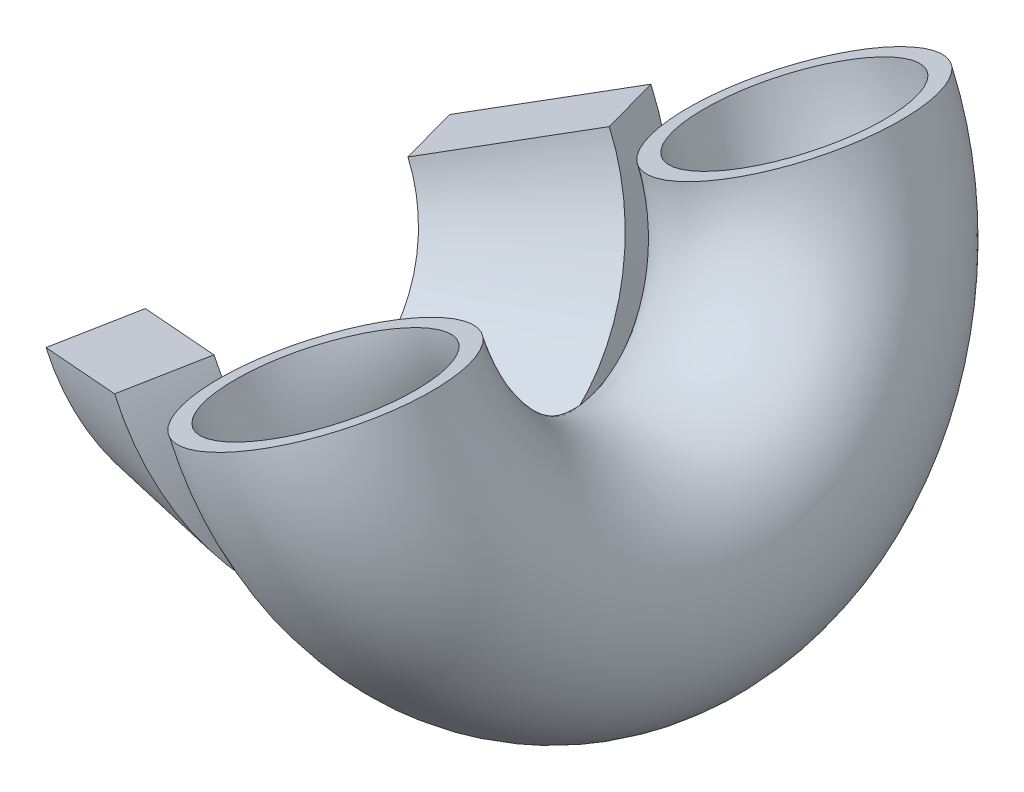
ISO-10303-21;
HEADER;
FILE_DESCRIPTION(('STEP AP214'),'2;1');
FILE_NAME('part.step','',(''),(''),'','','');
FILE_SCHEMA(('AUTOMOTIVE_DESIGN { 1 0 10303 214 1 1 1 1 }'));
ENDSEC;
DATA;
#1=APPLICATION_CONTEXT('core data for automotive mechanical design processes');
#2=APPLICATION_PROTOCOL_DEFINITION('international standard','automotive_design',2000,#1);
#3=PRODUCT_CONTEXT('',#1,'mechanical');
#4=PRODUCT('Part','Part','',(#3));
#5=PRODUCT_RELATED_PRODUCT_CATEGORY('part','',(#4));
#6=PRODUCT_DEFINITION_FORMATION('','',#4);
#7=PRODUCT_DEFINITION_CONTEXT('part definition',#1,'design');
#8=PRODUCT_DEFINITION('design','',#6,#7);
#9=PRODUCT_DEFINITION_SHAPE('','',#8);
#10=(LENGTH_UNIT() NAMED_UNIT(*) SI_UNIT(.MILLI.,.METRE.));
#11=(NAMED_UNIT(*) PLANE_ANGLE_UNIT() SI_UNIT($,.RADIAN.));
#12=(NAMED_UNIT(*) SI_UNIT($,.STERADIAN.) SOLID_ANGLE_UNIT());
#13=UNCERTAINTY_MEASURE_WITH_UNIT(LENGTH_MEASURE(1.E-05),#10,'distance_accuracy_value','');
#14=(GEOMETRIC_REPRESENTATION_CONTEXT(3) GLOBAL_UNCERTAINTY_ASSIGNED_CONTEXT((#13)) GLOBAL_UNIT_ASSIGNED_CONTEXT((#10,
#11,#12)) REPRESENTATION_CONTEXT('',''));
#15=CARTESIAN_POINT('',(0.,0.,0.));
#16=DIRECTION('',(0.,0.,1.));
#17=DIRECTION('',(1.,0.,0.));
#18=AXIS2_PLACEMENT_3D('',#15,#16,#17);
#19=CARTESIAN_POINT('',(162.778607617068,132.895760623175,0.));
#20=DIRECTION('',(-0.912334300033732,-0.409446119754431,0.));
#21=DIRECTION('',(0.409446119754431,-0.912334300033732,0.));
#22=AXIS2_PLACEMENT_3D('',#19,#20,#21);
#23=TOROIDAL_SURFACE('',#22,115.776176290142,48.7705177645636);
#24=CARTESIAN_POINT('',(162.778607617068,132.895760623175,-115.776176290142));
#25=DIRECTION('',(0.409446119754431,-0.912334300033732,0.));
#26=DIRECTION('',(0.83235387501804,0.373551739067688,-0.409446119754431));
#27=AXIS2_PLACEMENT_3D('',#24,#25,#26);
#28=CIRCLE('',#27,48.7705177645636);
#29=CARTESIAN_POINT('',(162.778607617067,132.895760623175,-164.546694054705));
#30=VERTEX_POINT('',#29);
#31=EDGE_CURVE('E52',#30,#30,#28,.T.);
#32=CARTESIAN_POINT('',(162.778607617067,132.895760623175,115.776176290142));
#33=DIRECTION('',(-0.409446119754431,0.912334300033732,0.));
#34=DIRECTION('',(0.832353875018039,0.373551739067688,0.409446119754431));
#35=AXIS2_PLACEMENT_3D('',#32,#33,#34);
#36=CIRCLE('',#35,48.7705177645636);
#37=CARTESIAN_POINT('',(162.778607617067,132.895760623175,164.546694054705));
#38=VERTEX_POINT('',#37);
#39=EDGE_CURVE('E60',#38,#38,#36,.T.);
#40=CARTESIAN_POINT('',(162.778607617068,132.895760623175,0.));
#41=DIRECTION('',(-0.912334300033732,-0.409446119754431,0.));
#42=DIRECTION('',(0.409446119754431,-0.912334300033732,0.));
#43=AXIS2_PLACEMENT_3D('',#40,#41,#42);
#44=CIRCLE('',#43,164.546694054705);
#45=EDGE_CURVE('',#30,#38,#44,.T.);
#46=ORIENTED_EDGE('',*,*,#31,.F.);
#47=ORIENTED_EDGE('',*,*,#39,.T.);
#48=ORIENTED_EDGE('',*,*,#45,.T.);
#49=ORIENTED_EDGE('',*,*,#45,.F.);
#50=EDGE_LOOP('',(#46,#48,#47,#49));
#51=FACE_BOUND('',#50,.T.);
#52=ADVANCED_FACE('F45',(#51),#23,.F.);
#53=CARTESIAN_POINT('',(162.778607617068,132.895760623175,0.));
#54=DIRECTION('',(-0.912334300033732,-0.409446119754431,0.));
#55=DIRECTION('',(0.409446119754431,-0.912334300033732,0.));
#56=AXIS2_PLACEMENT_3D('',#53,#54,#55);
#57=TOROIDAL_SURFACE('',#56,115.776176290142,57.544828499525);
#58=CARTESIAN_POINT('',(162.778607617068,132.895760623175,-115.776176290142));
#59=DIRECTION('',(0.409446119754431,-0.912334300033732,0.));
#60=DIRECTION('',(0.83235387501804,0.373551739067688,-0.409446119754431));
#61=AXIS2_PLACEMENT_3D('',#58,#59,#60);
#62=CIRCLE('',#61,57.544828499525);
#63=CARTESIAN_POINT('',(162.778607617067,132.895760623175,-173.321004789667));
#64=VERTEX_POINT('',#63);
#65=EDGE_CURVE('E11',#64,#64,#62,.T.);
#66=CARTESIAN_POINT('',(162.778607617067,132.895760623175,115.776176290142));
#67=DIRECTION('',(-0.409446119754431,0.912334300033732,0.));
#68=DIRECTION('',(0.832353875018039,0.373551739067688,0.409446119754431));
#69=AXIS2_PLACEMENT_3D('',#66,#67,#68);
#70=CIRCLE('',#69,57.544828499525);
#71=CARTESIAN_POINT('',(162.778607617067,132.895760623175,173.321004789667));
#72=VERTEX_POINT('',#71);
#73=EDGE_CURVE('E56',#72,#72,#70,.T.);
#74=CARTESIAN_POINT('',(162.778607617068,132.895760623175,0.));
#75=DIRECTION('',(-0.912334300033732,-0.409446119754431,0.));
#76=DIRECTION('',(0.409446119754431,-0.912334300033732,0.));
#77=AXIS2_PLACEMENT_3D('',#74,#75,#76);
#78=CIRCLE('',#77,173.321004789667);
#79=EDGE_CURVE('',#64,#72,#78,.T.);
#80=ORIENTED_EDGE('',*,*,#65,.T.);
#81=ORIENTED_EDGE('',*,*,#73,.F.);
#82=ORIENTED_EDGE('',*,*,#79,.T.);
#83=ORIENTED_EDGE('',*,*,#79,.F.);
#84=EDGE_LOOP('',(#80,#82,#81,#83));
#85=FACE_BOUND('',#84,.T.);
#86=ADVANCED_FACE('F47',(#85),#57,.T.);
#87=CARTESIAN_POINT('',(162.778607617068,132.895760623175,-115.776176290142));
#88=DIRECTION('',(0.409446119754431,-0.912334300033732,0.));
#89=DIRECTION('',(0.83235387501804,0.373551739067688,-0.409446119754431));
#90=AXIS2_PLACEMENT_3D('',#87,#88,#89);
#91=PLANE('',#90);
#92=ORIENTED_EDGE('',*,*,#31,.T.);
#93=EDGE_LOOP('',(#92));
#94=FACE_BOUND('',#93,.T.);
#95=ORIENTED_EDGE('',*,*,#65,.F.);
#96=EDGE_LOOP('',(#95));
#97=FACE_BOUND('',#96,.T.);
#98=ADVANCED_FACE('F70',(#94,#97),#91,.F.);
#99=CARTESIAN_POINT('',(162.778607617067,132.895760623175,115.776176290142));
#100=DIRECTION('',(-0.409446119754431,0.912334300033732,0.));
#101=DIRECTION('',(0.832353875018039,0.373551739067688,0.409446119754431));
#102=AXIS2_PLACEMENT_3D('',#99,#100,#101);
#103=PLANE('',#102);
#104=ORIENTED_EDGE('',*,*,#39,.F.);
#105=EDGE_LOOP('',(#104));
#106=FACE_BOUND('',#105,.T.);
#107=ORIENTED_EDGE('',*,*,#73,.T.);
#108=EDGE_LOOP('',(#107));
#109=FACE_BOUND('',#108,.T.);
#110=ADVANCED_FACE('F67',(#106,#109),#103,.T.);
#111=CLOSED_SHELL('',(#52,#86,#98,#110));
#112=MANIFOLD_SOLID_BREP('B2',#111);
#113=CARTESIAN_POINT('',(22.8915731877611,70.1159183560186,0.));
#114=DIRECTION('',(-0.912334300033732,-0.409446119754431,0.));
#115=DIRECTION('',(0.409446119754431,-0.912334300033732,0.));
#116=AXIS2_PLACEMENT_3D('',#113,#114,#115);
#117=CONICAL_SURFACE('',#116,64.8245191361788,1.14894944966694);
#118=CARTESIAN_POINT('',(8.63578069404582,63.718067348597,0.));
#119=DIRECTION('',(-0.912334300033732,-0.409446119754431,0.));
#120=DIRECTION('',(0.409446119754431,-0.912334300033732,0.));
#121=AXIS2_PLACEMENT_3D('',#118,#119,#120);
#122=CIRCLE('',#121,99.64178032372);
#123=CARTESIAN_POINT('',(8.63578069404566,63.7180673485973,-99.64178032372));
#124=VERTEX_POINT('',#123);
#125=CARTESIAN_POINT('',(8.63578069404564,63.7180673485973,99.64178032372));
#126=VERTEX_POINT('',#125);
#127=EDGE_CURVE('E43',#124,#126,#122,.T.);
#128=ORIENTED_EDGE('',*,*,#127,.T.);
#129=DIRECTION('',(-0.373551739067688,-0.167646124981957,0.912334300033732));
#130=VECTOR('',#129,1.);
#131=CARTESIAN_POINT('',(22.891573187761,70.1159183560188,64.8245191361788));
#132=LINE('',#131,#130);
#133=CARTESIAN_POINT('',(22.891573187761,70.1159183560188,64.8245191361788));
#134=VERTEX_POINT('',#133);
#135=EDGE_CURVE('E155',#134,#126,#132,.T.);
#136=ORIENTED_EDGE('',*,*,#135,.F.);
#137=CARTESIAN_POINT('',(22.8915731877611,70.1159183560186,0.));
#138=DIRECTION('',(-0.912334300033732,-0.409446119754431,0.));
#139=DIRECTION('',(0.409446119754431,-0.912334300033732,0.));
#140=AXIS2_PLACEMENT_3D('',#137,#138,#139);
#141=CIRCLE('',#140,64.8245191361788);
#142=CARTESIAN_POINT('',(22.891573187761,70.1159183560188,-64.8245191361788));
#143=VERTEX_POINT('',#142);
#144=EDGE_CURVE('E130',#143,#134,#141,.T.);
#145=ORIENTED_EDGE('',*,*,#144,.F.);
#146=DIRECTION('',(-0.373551739067688,-0.167646124981957,-0.912334300033732));
#147=VECTOR('',#146,1.);
#148=CARTESIAN_POINT('',(22.891573187761,70.1159183560188,-64.8245191361788));
#149=LINE('',#148,#147);
#150=EDGE_CURVE('E157',#143,#124,#149,.T.);
#151=ORIENTED_EDGE('',*,*,#150,.T.);
#152=EDGE_LOOP('',(#128,#136,#145,#151));
#153=FACE_BOUND('',#152,.T.);
#154=ADVANCED_FACE('F115',(#153),#117,.F.);
#155=CARTESIAN_POINT('',(8.63578069404582,63.718067348597,0.));
#156=DIRECTION('',(0.912334300033732,0.409446119754431,0.));
#157=DIRECTION('',(-0.409446119754431,0.912334300033732,0.));
#158=AXIS2_PLACEMENT_3D('',#155,#156,#157);
#159=CONICAL_SURFACE('',#158,99.64178032372,0.421846877127955);
#160=CARTESIAN_POINT('',(75.2928664656726,93.6330723224556,0.));
#161=DIRECTION('',(-0.912334300033732,-0.409446119754431,0.));
#162=DIRECTION('',(0.409446119754431,-0.912334300033732,0.));
#163=AXIS2_PLACEMENT_3D('',#160,#161,#162);
#164=CIRCLE('',#163,132.43130163488);
#165=CARTESIAN_POINT('',(75.2928664656724,93.633072322456,-132.43130163488));
#166=VERTEX_POINT('',#165);
#167=CARTESIAN_POINT('',(75.2928664656723,93.6330723224559,132.43130163488));
#168=VERTEX_POINT('',#167);
#169=EDGE_CURVE('E123',#166,#168,#164,.T.);
#170=ORIENTED_EDGE('',*,*,#169,.T.);
#171=DIRECTION('',(0.832353875018039,0.373551739067688,0.409446119754431));
#172=VECTOR('',#171,1.);
#173=CARTESIAN_POINT('',(8.63578069404564,63.7180673485973,99.64178032372));
#174=LINE('',#173,#172);
#175=EDGE_CURVE('E166',#126,#168,#174,.T.);
#176=ORIENTED_EDGE('',*,*,#175,.F.);
#177=ORIENTED_EDGE('',*,*,#127,.F.);
#178=DIRECTION('',(0.83235387501804,0.373551739067688,-0.409446119754431));
#179=VECTOR('',#178,1.);
#180=CARTESIAN_POINT('',(8.63578069404566,63.7180673485973,-99.64178032372));
#181=LINE('',#180,#179);
#182=EDGE_CURVE('E176',#124,#166,#181,.T.);
#183=ORIENTED_EDGE('',*,*,#182,.T.);
#184=EDGE_LOOP('',(#170,#176,#177,#183));
#185=FACE_BOUND('',#184,.T.);
#186=ADVANCED_FACE('F117',(#185),#159,.T.);
#187=CARTESIAN_POINT('',(75.2928664656726,93.6330723224556,0.));
#188=DIRECTION('',(-0.912334300033732,-0.409446119754431,0.));
#189=DIRECTION('',(0.409446119754431,-0.912334300033732,0.));
#190=AXIS2_PLACEMENT_3D('',#187,#188,#189);
#191=CONICAL_SURFACE('',#190,132.43130163488,1.14894944966694);
#192=CARTESIAN_POINT('',(89.5486589593879,100.030923329877,0.));
#193=DIRECTION('',(-0.912334300033732,-0.409446119754431,0.));
#194=DIRECTION('',(0.409446119754431,-0.912334300033732,0.));
#195=AXIS2_PLACEMENT_3D('',#192,#193,#194);
#196=CIRCLE('',#195,97.614040447339);
#197=CARTESIAN_POINT('',(89.5486589593877,100.030923329877,-97.614040447339));
#198=VERTEX_POINT('',#197);
#199=CARTESIAN_POINT('',(89.5486589593877,100.030923329877,97.614040447339));
#200=VERTEX_POINT('',#199);
#201=EDGE_CURVE('E138',#198,#200,#196,.T.);
#202=ORIENTED_EDGE('',*,*,#201,.T.);
#203=DIRECTION('',(0.373551739067688,0.167646124981957,-0.912334300033732));
#204=VECTOR('',#203,1.);
#205=CARTESIAN_POINT('',(89.5486589593877,100.030923329877,97.614040447339));
#206=LINE('',#205,#204);
#207=EDGE_CURVE('E170',#168,#200,#206,.T.);
#208=ORIENTED_EDGE('',*,*,#207,.F.);
#209=ORIENTED_EDGE('',*,*,#169,.F.);
#210=DIRECTION('',(0.373551739067688,0.167646124981957,0.912334300033732));
#211=VECTOR('',#210,1.);
#212=CARTESIAN_POINT('',(89.5486589593877,100.030923329877,-97.614040447339));
#213=LINE('',#212,#211);
#214=EDGE_CURVE('E178',#166,#198,#213,.T.);
#215=ORIENTED_EDGE('',*,*,#214,.T.);
#216=EDGE_LOOP('',(#202,#208,#209,#215));
#217=FACE_BOUND('',#216,.T.);
#218=ADVANCED_FACE('F184',(#217),#191,.T.);
#219=CARTESIAN_POINT('',(89.5486589593879,100.030923329877,0.));
#220=DIRECTION('',(0.912334300033732,0.409446119754431,0.));
#221=DIRECTION('',(-0.409446119754431,0.912334300033732,0.));
#222=AXIS2_PLACEMENT_3D('',#219,#220,#221);
#223=CONICAL_SURFACE('',#222,97.614040447339,0.421846877127955);
#224=DIRECTION('',(-0.83235387501804,-0.373551739067688,0.409446119754431));
#225=VECTOR('',#224,1.);
#226=CARTESIAN_POINT('',(22.891573187761,70.1159183560188,-64.8245191361788));
#227=LINE('',#226,#225);
#228=EDGE_CURVE('E180',#198,#143,#227,.T.);
#229=ORIENTED_EDGE('',*,*,#228,.T.);
#230=ORIENTED_EDGE('',*,*,#144,.T.);
#231=DIRECTION('',(-0.832353875018039,-0.373551739067688,-0.409446119754431));
#232=VECTOR('',#231,1.);
#233=CARTESIAN_POINT('',(22.891573187761,70.1159183560188,64.8245191361788));
#234=LINE('',#233,#232);
#235=EDGE_CURVE('E168',#200,#134,#234,.T.);
#236=ORIENTED_EDGE('',*,*,#235,.F.);
#237=ORIENTED_EDGE('',*,*,#201,.F.);
#238=EDGE_LOOP('',(#229,#230,#236,#237));
#239=FACE_BOUND('',#238,.T.);
#240=ADVANCED_FACE('F187',(#239),#223,.F.);
#241=CARTESIAN_POINT('',(-22.3542396985497,49.8100693697974,-54.5962914777571));
#242=DIRECTION('',(0.409446119754431,-0.912334300033732,0.));
#243=DIRECTION('',(0.83235387501804,0.373551739067688,-0.409446119754431));
#244=AXIS2_PLACEMENT_3D('',#241,#242,#243);
#245=PLANE('',#244);
#246=ORIENTED_EDGE('',*,*,#150,.F.);
#247=ORIENTED_EDGE('',*,*,#228,.F.);
#248=ORIENTED_EDGE('',*,*,#214,.F.);
#249=ORIENTED_EDGE('',*,*,#182,.F.);
#250=EDGE_LOOP('',(#246,#247,#248,#249));
#251=FACE_BOUND('',#250,.T.);
#252=ADVANCED_FACE('F189',(#251),#245,.F.);
#253=CARTESIAN_POINT('',(-22.3542396985497,49.8100693697974,54.5962914777571));
#254=DIRECTION('',(-0.409446119754431,0.912334300033732,0.));
#255=DIRECTION('',(0.832353875018039,0.373551739067688,0.409446119754431));
#256=AXIS2_PLACEMENT_3D('',#253,#254,#255);
#257=PLANE('',#256);
#258=ORIENTED_EDGE('',*,*,#135,.T.);
#259=ORIENTED_EDGE('',*,*,#175,.T.);
#260=ORIENTED_EDGE('',*,*,#207,.T.);
#261=ORIENTED_EDGE('',*,*,#235,.T.);
#262=EDGE_LOOP('',(#258,#259,#260,#261));
#263=FACE_BOUND('',#262,.T.);
#264=ADVANCED_FACE('F164',(#263),#257,.T.);
#265=CLOSED_SHELL('',(#154,#186,#218,#240,#252,#264));
#266=MANIFOLD_SOLID_BREP('B6',#265);
#267=ADVANCED_BREP_SHAPE_REPRESENTATION('',(#18,#112,#266),#14);
#268=SHAPE_DEFINITION_REPRESENTATION(#9,#267);
ENDSEC;
END-ISO-10303-21;
